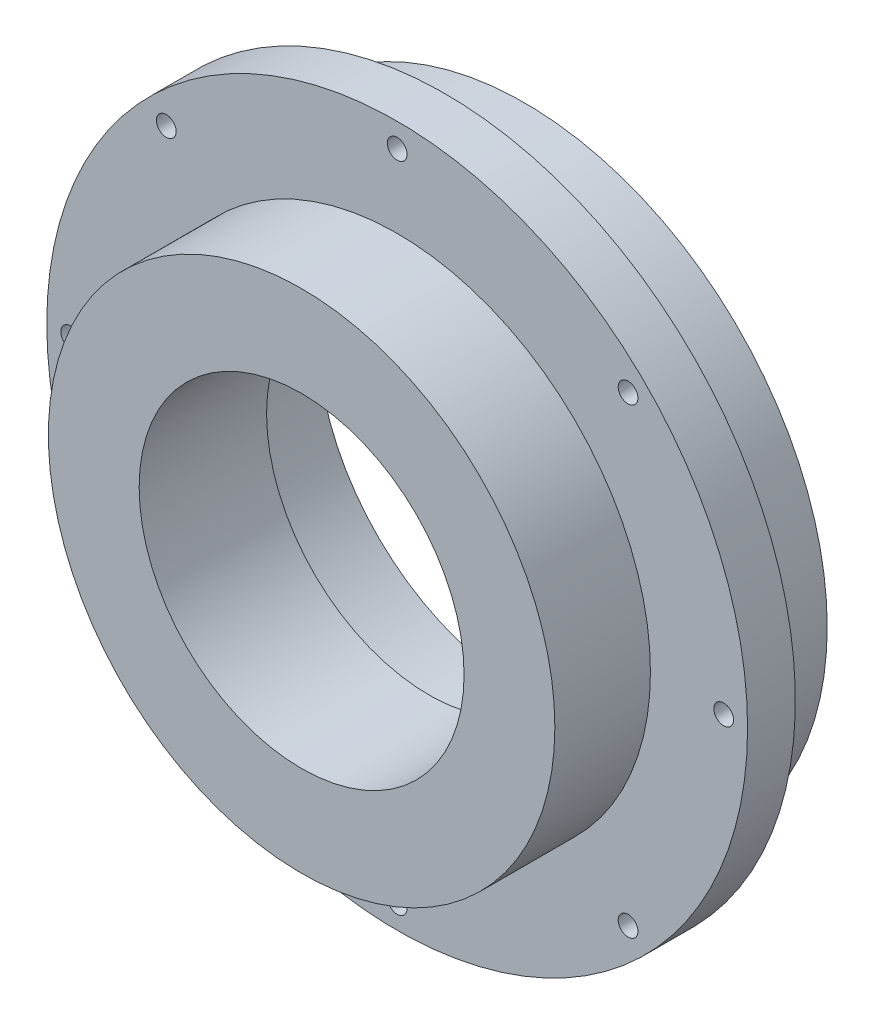
ISO-10303-21;
HEADER;
FILE_DESCRIPTION(('STEP AP214'),'2;1');
FILE_NAME('part.step','',(''),(''),'','','');
FILE_SCHEMA(('AUTOMOTIVE_DESIGN { 1 0 10303 214 1 1 1 1 }'));
ENDSEC;
DATA;
#1=APPLICATION_CONTEXT('core data for automotive mechanical design processes');
#2=APPLICATION_PROTOCOL_DEFINITION('international standard','automotive_design',2000,#1);
#3=PRODUCT_CONTEXT('',#1,'mechanical');
#4=PRODUCT('Part','Part','',(#3));
#5=PRODUCT_RELATED_PRODUCT_CATEGORY('part','',(#4));
#6=PRODUCT_DEFINITION_FORMATION('','',#4);
#7=PRODUCT_DEFINITION_CONTEXT('part definition',#1,'design');
#8=PRODUCT_DEFINITION('design','',#6,#7);
#9=PRODUCT_DEFINITION_SHAPE('','',#8);
#10=(LENGTH_UNIT() NAMED_UNIT(*) SI_UNIT(.MILLI.,.METRE.));
#11=(NAMED_UNIT(*) PLANE_ANGLE_UNIT() SI_UNIT($,.RADIAN.));
#12=(NAMED_UNIT(*) SI_UNIT($,.STERADIAN.) SOLID_ANGLE_UNIT());
#13=UNCERTAINTY_MEASURE_WITH_UNIT(LENGTH_MEASURE(1.E-05),#10,'distance_accuracy_value','');
#14=(GEOMETRIC_REPRESENTATION_CONTEXT(3) GLOBAL_UNCERTAINTY_ASSIGNED_CONTEXT((#13)) GLOBAL_UNIT_ASSIGNED_CONTEXT((#10,
#11,#12)) REPRESENTATION_CONTEXT('',''));
#15=CARTESIAN_POINT('',(0.,0.,0.));
#16=DIRECTION('',(0.,0.,1.));
#17=DIRECTION('',(1.,0.,0.));
#18=AXIS2_PLACEMENT_3D('',#15,#16,#17);
#19=CARTESIAN_POINT('',(0.,0.,10.));
#20=DIRECTION('',(0.,0.,-1.));
#21=DIRECTION('',(-1.,0.,0.));
#22=AXIS2_PLACEMENT_3D('',#19,#20,#21);
#23=CYLINDRICAL_SURFACE('',#22,55.);
#24=CARTESIAN_POINT('',(0.,0.,10.));
#25=DIRECTION('',(0.,0.,1.));
#26=DIRECTION('',(1.,0.,0.));
#27=AXIS2_PLACEMENT_3D('',#24,#25,#26);
#28=CIRCLE('',#27,55.);
#29=CARTESIAN_POINT('',(55.,0.,10.));
#30=VERTEX_POINT('',#29);
#31=EDGE_CURVE('E44',#30,#30,#28,.T.);
#32=ORIENTED_EDGE('',*,*,#31,.F.);
#33=EDGE_LOOP('',(#32));
#34=FACE_BOUND('',#33,.T.);
#35=CARTESIAN_POINT('',(0.,0.,2.5));
#36=DIRECTION('',(0.,0.,-1.));
#37=DIRECTION('',(-1.,0.,0.));
#38=AXIS2_PLACEMENT_3D('',#35,#36,#37);
#39=CIRCLE('',#38,55.);
#40=CARTESIAN_POINT('',(-55.,0.,2.5));
#41=VERTEX_POINT('',#40);
#42=EDGE_CURVE('E41',#41,#41,#39,.T.);
#43=ORIENTED_EDGE('',*,*,#42,.F.);
#44=EDGE_LOOP('',(#43));
#45=FACE_BOUND('',#44,.T.);
#46=ADVANCED_FACE('F36',(#34,#45),#23,.T.);
#47=CARTESIAN_POINT('',(0.,0.,10.));
#48=DIRECTION('',(0.,0.,1.));
#49=DIRECTION('',(1.,0.,0.));
#50=AXIS2_PLACEMENT_3D('',#47,#48,#49);
#51=PLANE('',#50);
#52=CARTESIAN_POINT('',(0.,0.,10.));
#53=DIRECTION('',(0.,0.,1.));
#54=DIRECTION('',(1.,0.,0.));
#55=AXIS2_PLACEMENT_3D('',#52,#53,#54);
#56=CIRCLE('',#55,39.75);
#57=CARTESIAN_POINT('',(39.75,0.,10.));
#58=VERTEX_POINT('',#57);
#59=EDGE_CURVE('E11',#58,#58,#56,.T.);
#60=ORIENTED_EDGE('',*,*,#59,.F.);
#61=EDGE_LOOP('',(#60));
#62=FACE_BOUND('',#61,.T.);
#63=CARTESIAN_POINT('',(51.25,-1.78938418615711E-13,10.));
#64=DIRECTION('',(0.,0.,-1.));
#65=DIRECTION('',(0.,1.,0.));
#66=AXIS2_PLACEMENT_3D('',#63,#64,#65);
#67=CIRCLE('',#66,1.55);
#68=CARTESIAN_POINT('',(51.25,1.54999999999982,10.));
#69=VERTEX_POINT('',#68);
#70=EDGE_CURVE('E77',#69,#69,#67,.T.);
#71=ORIENTED_EDGE('',*,*,#70,.T.);
#72=EDGE_LOOP('',(#71));
#73=FACE_BOUND('',#72,.T.);
#74=CARTESIAN_POINT('',(36.2392225358104,-36.2392225358108,10.));
#75=DIRECTION('',(0.,0.,-1.));
#76=DIRECTION('',(0.707106781186551,0.707106781186544,0.));
#77=AXIS2_PLACEMENT_3D('',#74,#75,#76);
#78=CIRCLE('',#77,1.55);
#79=CARTESIAN_POINT('',(37.3352380466495,-35.1432070249716,10.));
#80=VERTEX_POINT('',#79);
#81=EDGE_CURVE('E84',#80,#80,#78,.T.);
#82=ORIENTED_EDGE('',*,*,#81,.T.);
#83=EDGE_LOOP('',(#82));
#84=FACE_BOUND('',#83,.T.);
#85=CARTESIAN_POINT('',(0.,-51.25,10.));
#86=DIRECTION('',(0.,0.,-1.));
#87=DIRECTION('',(1.,0.,0.));
#88=AXIS2_PLACEMENT_3D('',#85,#86,#87);
#89=CIRCLE('',#88,1.55);
#90=CARTESIAN_POINT('',(1.55,-51.25,10.));
#91=VERTEX_POINT('',#90);
#92=EDGE_CURVE('E86',#91,#91,#89,.T.);
#93=ORIENTED_EDGE('',*,*,#92,.T.);
#94=EDGE_LOOP('',(#93));
#95=FACE_BOUND('',#94,.T.);
#96=CARTESIAN_POINT('',(-36.2392225358109,-36.2392225358102,10.));
#97=DIRECTION('',(0.,0.,-1.));
#98=DIRECTION('',(0.707106781186541,-0.707106781186554,0.));
#99=AXIS2_PLACEMENT_3D('',#96,#97,#98);
#100=CIRCLE('',#99,1.55);
#101=CARTESIAN_POINT('',(-35.1432070249717,-37.3352380466494,10.));
#102=VERTEX_POINT('',#101);
#103=EDGE_CURVE('E91',#102,#102,#100,.T.);
#104=ORIENTED_EDGE('',*,*,#103,.T.);
#105=EDGE_LOOP('',(#104));
#106=FACE_BOUND('',#105,.T.);
#107=CARTESIAN_POINT('',(-51.25,5.36815255847132E-13,10.));
#108=DIRECTION('',(0.,0.,-1.));
#109=DIRECTION('',(0.,-1.,0.));
#110=AXIS2_PLACEMENT_3D('',#107,#108,#109);
#111=CIRCLE('',#110,1.55);
#112=CARTESIAN_POINT('',(-51.25,-1.54999999999946,10.));
#113=VERTEX_POINT('',#112);
#114=EDGE_CURVE('E61',#113,#113,#111,.T.);
#115=ORIENTED_EDGE('',*,*,#114,.T.);
#116=EDGE_LOOP('',(#115));
#117=FACE_BOUND('',#116,.T.);
#118=CARTESIAN_POINT('',(-36.2392225358101,36.239222535811,10.));
#119=DIRECTION('',(0.,0.,-1.));
#120=DIRECTION('',(-0.707106781186556,-0.707106781186539,0.));
#121=AXIS2_PLACEMENT_3D('',#118,#119,#120);
#122=CIRCLE('',#121,1.55);
#123=CARTESIAN_POINT('',(-37.3352380466493,35.1432070249719,10.));
#124=VERTEX_POINT('',#123);
#125=EDGE_CURVE('E72',#124,#124,#122,.T.);
#126=ORIENTED_EDGE('',*,*,#125,.T.);
#127=EDGE_LOOP('',(#126));
#128=FACE_BOUND('',#127,.T.);
#129=CARTESIAN_POINT('',(36.2392225358106,36.2392225358105,10.));
#130=DIRECTION('',(0.,0.,-1.));
#131=DIRECTION('',(-0.707106781186546,0.707106781186549,0.));
#132=AXIS2_PLACEMENT_3D('',#129,#130,#131);
#133=CIRCLE('',#132,1.55);
#134=CARTESIAN_POINT('',(35.1432070249715,37.3352380466497,10.));
#135=VERTEX_POINT('',#134);
#136=EDGE_CURVE('E99',#135,#135,#133,.T.);
#137=ORIENTED_EDGE('',*,*,#136,.T.);
#138=EDGE_LOOP('',(#137));
#139=FACE_BOUND('',#138,.T.);
#140=CARTESIAN_POINT('',(0.,51.25,10.));
#141=DIRECTION('',(0.,0.,-1.));
#142=DIRECTION('',(-1.,0.,0.));
#143=AXIS2_PLACEMENT_3D('',#140,#141,#142);
#144=CIRCLE('',#143,1.55);
#145=CARTESIAN_POINT('',(-1.55,51.25,10.));
#146=VERTEX_POINT('',#145);
#147=EDGE_CURVE('E106',#146,#146,#144,.T.);
#148=ORIENTED_EDGE('',*,*,#147,.T.);
#149=EDGE_LOOP('',(#148));
#150=FACE_BOUND('',#149,.T.);
#151=ORIENTED_EDGE('',*,*,#31,.T.);
#152=EDGE_LOOP('',(#151));
#153=FACE_BOUND('',#152,.T.);
#154=ADVANCED_FACE('F134',(#62,#73,#84,#95,#106,#117,#128,#139,#150,#153),#51,.T.);
#155=CARTESIAN_POINT('',(0.,0.,2.5));
#156=DIRECTION('',(0.,0.,-1.));
#157=DIRECTION('',(-1.,0.,0.));
#158=AXIS2_PLACEMENT_3D('',#155,#156,#157);
#159=PLANE('',#158);
#160=CARTESIAN_POINT('',(51.25,-1.78938418615711E-13,2.5));
#161=DIRECTION('',(0.,0.,-1.));
#162=DIRECTION('',(0.,1.,0.));
#163=AXIS2_PLACEMENT_3D('',#160,#161,#162);
#164=CIRCLE('',#163,1.55);
#165=CARTESIAN_POINT('',(51.25,1.54999999999982,2.5));
#166=VERTEX_POINT('',#165);
#167=EDGE_CURVE('E78',#166,#166,#164,.T.);
#168=ORIENTED_EDGE('',*,*,#167,.F.);
#169=EDGE_LOOP('',(#168));
#170=FACE_BOUND('',#169,.T.);
#171=CARTESIAN_POINT('',(36.2392225358104,-36.2392225358108,2.5));
#172=DIRECTION('',(0.,0.,-1.));
#173=DIRECTION('',(0.707106781186551,0.707106781186544,0.));
#174=AXIS2_PLACEMENT_3D('',#171,#172,#173);
#175=CIRCLE('',#174,1.55);
#176=CARTESIAN_POINT('',(37.3352380466495,-35.1432070249716,2.5));
#177=VERTEX_POINT('',#176);
#178=EDGE_CURVE('E87',#177,#177,#175,.T.);
#179=ORIENTED_EDGE('',*,*,#178,.F.);
#180=EDGE_LOOP('',(#179));
#181=FACE_BOUND('',#180,.T.);
#182=CARTESIAN_POINT('',(0.,-51.25,2.5));
#183=DIRECTION('',(0.,0.,-1.));
#184=DIRECTION('',(1.,0.,0.));
#185=AXIS2_PLACEMENT_3D('',#182,#183,#184);
#186=CIRCLE('',#185,1.55);
#187=CARTESIAN_POINT('',(1.55,-51.25,2.5));
#188=VERTEX_POINT('',#187);
#189=EDGE_CURVE('E95',#188,#188,#186,.T.);
#190=ORIENTED_EDGE('',*,*,#189,.F.);
#191=EDGE_LOOP('',(#190));
#192=FACE_BOUND('',#191,.T.);
#193=CARTESIAN_POINT('',(-36.2392225358109,-36.2392225358102,2.5));
#194=DIRECTION('',(0.,0.,-1.));
#195=DIRECTION('',(0.707106781186541,-0.707106781186554,0.));
#196=AXIS2_PLACEMENT_3D('',#193,#194,#195);
#197=CIRCLE('',#196,1.55);
#198=CARTESIAN_POINT('',(-35.1432070249717,-37.3352380466494,2.5));
#199=VERTEX_POINT('',#198);
#200=EDGE_CURVE('E70',#199,#199,#197,.T.);
#201=ORIENTED_EDGE('',*,*,#200,.F.);
#202=EDGE_LOOP('',(#201));
#203=FACE_BOUND('',#202,.T.);
#204=CARTESIAN_POINT('',(-51.25,5.36815255847132E-13,2.5));
#205=DIRECTION('',(0.,0.,-1.));
#206=DIRECTION('',(0.,-1.,0.));
#207=AXIS2_PLACEMENT_3D('',#204,#205,#206);
#208=CIRCLE('',#207,1.55);
#209=CARTESIAN_POINT('',(-51.25,-1.54999999999946,2.5));
#210=VERTEX_POINT('',#209);
#211=EDGE_CURVE('E69',#210,#210,#208,.T.);
#212=ORIENTED_EDGE('',*,*,#211,.F.);
#213=EDGE_LOOP('',(#212));
#214=FACE_BOUND('',#213,.T.);
#215=CARTESIAN_POINT('',(-36.2392225358101,36.239222535811,2.5));
#216=DIRECTION('',(0.,0.,-1.));
#217=DIRECTION('',(-0.707106781186556,-0.707106781186539,0.));
#218=AXIS2_PLACEMENT_3D('',#215,#216,#217);
#219=CIRCLE('',#218,1.55);
#220=CARTESIAN_POINT('',(-37.3352380466493,35.1432070249719,2.5));
#221=VERTEX_POINT('',#220);
#222=EDGE_CURVE('E62',#221,#221,#219,.T.);
#223=ORIENTED_EDGE('',*,*,#222,.F.);
#224=EDGE_LOOP('',(#223));
#225=FACE_BOUND('',#224,.T.);
#226=CARTESIAN_POINT('',(36.2392225358106,36.2392225358105,2.5));
#227=DIRECTION('',(0.,0.,-1.));
#228=DIRECTION('',(-0.707106781186546,0.707106781186549,0.));
#229=AXIS2_PLACEMENT_3D('',#226,#227,#228);
#230=CIRCLE('',#229,1.55);
#231=CARTESIAN_POINT('',(35.1432070249715,37.3352380466497,2.5));
#232=VERTEX_POINT('',#231);
#233=EDGE_CURVE('E79',#232,#232,#230,.T.);
#234=ORIENTED_EDGE('',*,*,#233,.F.);
#235=EDGE_LOOP('',(#234));
#236=FACE_BOUND('',#235,.T.);
#237=CARTESIAN_POINT('',(0.,51.25,2.5));
#238=DIRECTION('',(0.,0.,-1.));
#239=DIRECTION('',(-1.,0.,0.));
#240=AXIS2_PLACEMENT_3D('',#237,#238,#239);
#241=CIRCLE('',#240,1.55);
#242=CARTESIAN_POINT('',(-1.55,51.25,2.5));
#243=VERTEX_POINT('',#242);
#244=EDGE_CURVE('E101',#243,#243,#241,.T.);
#245=ORIENTED_EDGE('',*,*,#244,.F.);
#246=EDGE_LOOP('',(#245));
#247=FACE_BOUND('',#246,.T.);
#248=CARTESIAN_POINT('',(0.,0.,2.5));
#249=DIRECTION('',(0.,0.,-1.));
#250=DIRECTION('',(-1.,0.,0.));
#251=AXIS2_PLACEMENT_3D('',#248,#249,#250);
#252=CIRCLE('',#251,47.5);
#253=CARTESIAN_POINT('',(-47.5,0.,2.5));
#254=VERTEX_POINT('',#253);
#255=EDGE_CURVE('E115',#254,#254,#252,.T.);
#256=ORIENTED_EDGE('',*,*,#255,.F.);
#257=EDGE_LOOP('',(#256));
#258=FACE_BOUND('',#257,.T.);
#259=ORIENTED_EDGE('',*,*,#42,.T.);
#260=EDGE_LOOP('',(#259));
#261=FACE_BOUND('',#260,.T.);
#262=ADVANCED_FACE('F125',(#170,#181,#192,#203,#214,#225,#236,#247,#258,#261),#159,.T.);
#263=CARTESIAN_POINT('',(0.,0.,2.5));
#264=DIRECTION('',(0.,0.,-1.));
#265=DIRECTION('',(-1.,0.,0.));
#266=AXIS2_PLACEMENT_3D('',#263,#264,#265);
#267=CYLINDRICAL_SURFACE('',#266,47.5);
#268=ORIENTED_EDGE('',*,*,#255,.T.);
#269=EDGE_LOOP('',(#268));
#270=FACE_BOUND('',#269,.T.);
#271=CARTESIAN_POINT('',(0.,0.,-10.));
#272=DIRECTION('',(0.,0.,-1.));
#273=DIRECTION('',(-1.,0.,0.));
#274=AXIS2_PLACEMENT_3D('',#271,#272,#273);
#275=CIRCLE('',#274,47.5);
#276=CARTESIAN_POINT('',(-47.5,0.,-10.));
#277=VERTEX_POINT('',#276);
#278=EDGE_CURVE('E107',#277,#277,#275,.T.);
#279=ORIENTED_EDGE('',*,*,#278,.F.);
#280=EDGE_LOOP('',(#279));
#281=FACE_BOUND('',#280,.T.);
#282=ADVANCED_FACE('F119',(#270,#281),#267,.T.);
#283=CARTESIAN_POINT('',(0.,0.,-10.));
#284=DIRECTION('',(0.,0.,1.));
#285=DIRECTION('',(1.,0.,0.));
#286=AXIS2_PLACEMENT_3D('',#283,#284,#285);
#287=PLANE('',#286);
#288=CARTESIAN_POINT('',(-39.2648801317297,16.2640458755162,-10.));
#289=DIRECTION('',(0.,0.,-1.));
#290=DIRECTION('',(-1.,0.,0.));
#291=AXIS2_PLACEMENT_3D('',#288,#289,#290);
#292=CIRCLE('',#291,1.5);
#293=CARTESIAN_POINT('',(-40.7648801317297,16.2640458755162,-10.));
#294=VERTEX_POINT('',#293);
#295=EDGE_CURVE('E297',#294,#294,#292,.T.);
#296=ORIENTED_EDGE('',*,*,#295,.F.);
#297=EDGE_LOOP('',(#296));
#298=FACE_BOUND('',#297,.T.);
#299=CARTESIAN_POINT('',(39.2648801317296,-16.2640458755165,-10.));
#300=DIRECTION('',(0.,0.,-1.));
#301=DIRECTION('',(-1.,0.,0.));
#302=AXIS2_PLACEMENT_3D('',#299,#300,#301);
#303=CIRCLE('',#302,1.5);
#304=CARTESIAN_POINT('',(37.7648801317296,-16.2640458755165,-10.));
#305=VERTEX_POINT('',#304);
#306=EDGE_CURVE('E317',#305,#305,#303,.T.);
#307=ORIENTED_EDGE('',*,*,#306,.F.);
#308=EDGE_LOOP('',(#307));
#309=FACE_BOUND('',#308,.T.);
#310=CARTESIAN_POINT('',(16.2640458755161,-39.2648801317298,-10.));
#311=DIRECTION('',(0.,0.,-1.));
#312=DIRECTION('',(-1.,0.,0.));
#313=AXIS2_PLACEMENT_3D('',#310,#311,#312);
#314=CIRCLE('',#313,1.46446648593793);
#315=CARTESIAN_POINT('',(14.7995793895782,-39.2648801317298,-10.));
#316=VERTEX_POINT('',#315);
#317=EDGE_CURVE('E335',#316,#316,#314,.T.);
#318=ORIENTED_EDGE('',*,*,#317,.F.);
#319=EDGE_LOOP('',(#318));
#320=FACE_BOUND('',#319,.T.);
#321=CARTESIAN_POINT('',(-39.2648801317296,-16.2640458755165,-10.));
#322=DIRECTION('',(0.,0.,-1.));
#323=DIRECTION('',(-1.,0.,0.));
#324=AXIS2_PLACEMENT_3D('',#321,#322,#323);
#325=CIRCLE('',#324,1.5);
#326=CARTESIAN_POINT('',(-40.7648801317296,-16.2640458755165,-10.));
#327=VERTEX_POINT('',#326);
#328=EDGE_CURVE('E323',#327,#327,#325,.T.);
#329=ORIENTED_EDGE('',*,*,#328,.F.);
#330=EDGE_LOOP('',(#329));
#331=FACE_BOUND('',#330,.T.);
#332=CARTESIAN_POINT('',(-16.2640458755163,39.2648801317297,-10.));
#333=DIRECTION('',(0.,0.,-1.));
#334=DIRECTION('',(-1.,0.,0.));
#335=AXIS2_PLACEMENT_3D('',#332,#333,#334);
#336=CIRCLE('',#335,1.5);
#337=CARTESIAN_POINT('',(-17.7640458755163,39.2648801317297,-10.));
#338=VERTEX_POINT('',#337);
#339=EDGE_CURVE('E294',#338,#338,#336,.T.);
#340=ORIENTED_EDGE('',*,*,#339,.F.);
#341=EDGE_LOOP('',(#340));
#342=FACE_BOUND('',#341,.T.);
#343=CARTESIAN_POINT('',(16.2640458755161,39.2648801317298,-10.));
#344=DIRECTION('',(0.,0.,-1.));
#345=DIRECTION('',(-1.,0.,0.));
#346=AXIS2_PLACEMENT_3D('',#343,#344,#345);
#347=CIRCLE('',#346,1.5);
#348=CARTESIAN_POINT('',(14.7640458755161,39.2648801317298,-10.));
#349=VERTEX_POINT('',#348);
#350=EDGE_CURVE('E305',#349,#349,#347,.T.);
#351=ORIENTED_EDGE('',*,*,#350,.F.);
#352=EDGE_LOOP('',(#351));
#353=FACE_BOUND('',#352,.T.);
#354=CARTESIAN_POINT('',(39.2648801317297,16.2640458755162,-10.));
#355=DIRECTION('',(0.,0.,-1.));
#356=DIRECTION('',(-1.,0.,0.));
#357=AXIS2_PLACEMENT_3D('',#354,#355,#356);
#358=CIRCLE('',#357,1.5);
#359=CARTESIAN_POINT('',(37.7648801317297,16.2640458755162,-10.));
#360=VERTEX_POINT('',#359);
#361=EDGE_CURVE('E309',#360,#360,#358,.T.);
#362=ORIENTED_EDGE('',*,*,#361,.F.);
#363=EDGE_LOOP('',(#362));
#364=FACE_BOUND('',#363,.T.);
#365=CARTESIAN_POINT('',(-16.2640458755161,-39.2648801317298,-10.));
#366=DIRECTION('',(0.,0.,-1.));
#367=DIRECTION('',(-1.,0.,0.));
#368=AXIS2_PLACEMENT_3D('',#365,#366,#367);
#369=CIRCLE('',#368,1.5);
#370=CARTESIAN_POINT('',(-17.7640458755161,-39.2648801317298,-10.));
#371=VERTEX_POINT('',#370);
#372=EDGE_CURVE('E329',#371,#371,#369,.T.);
#373=ORIENTED_EDGE('',*,*,#372,.F.);
#374=EDGE_LOOP('',(#373));
#375=FACE_BOUND('',#374,.T.);
#376=CARTESIAN_POINT('',(0.,0.,-10.));
#377=DIRECTION('',(0.,0.,-1.));
#378=DIRECTION('',(-1.,0.,0.));
#379=AXIS2_PLACEMENT_3D('',#376,#377,#378);
#380=CIRCLE('',#379,32.525);
#381=CARTESIAN_POINT('',(-32.525,0.,-10.));
#382=VERTEX_POINT('',#381);
#383=EDGE_CURVE('E60',#382,#382,#380,.T.);
#384=ORIENTED_EDGE('',*,*,#383,.F.);
#385=EDGE_LOOP('',(#384));
#386=FACE_BOUND('',#385,.T.);
#387=ORIENTED_EDGE('',*,*,#278,.T.);
#388=EDGE_LOOP('',(#387));
#389=FACE_BOUND('',#388,.T.);
#390=ADVANCED_FACE('F117',(#298,#309,#320,#331,#342,#353,#364,#375,#386,#389),#287,.F.);
#391=CARTESIAN_POINT('',(0.,51.25,10.));
#392=DIRECTION('',(0.,0.,-1.));
#393=DIRECTION('',(-1.,0.,0.));
#394=AXIS2_PLACEMENT_3D('',#391,#392,#393);
#395=CYLINDRICAL_SURFACE('',#394,1.55);
#396=ORIENTED_EDGE('',*,*,#147,.F.);
#397=EDGE_LOOP('',(#396));
#398=FACE_BOUND('',#397,.T.);
#399=ORIENTED_EDGE('',*,*,#244,.T.);
#400=EDGE_LOOP('',(#399));
#401=FACE_BOUND('',#400,.T.);
#402=ADVANCED_FACE('F128',(#398,#401),#395,.F.);
#403=CARTESIAN_POINT('',(36.2392225358106,36.2392225358105,10.));
#404=DIRECTION('',(0.,0.,-1.));
#405=DIRECTION('',(-1.,0.,0.));
#406=AXIS2_PLACEMENT_3D('',#403,#404,#405);
#407=CYLINDRICAL_SURFACE('',#406,1.55);
#408=ORIENTED_EDGE('',*,*,#136,.F.);
#409=EDGE_LOOP('',(#408));
#410=FACE_BOUND('',#409,.T.);
#411=ORIENTED_EDGE('',*,*,#233,.T.);
#412=EDGE_LOOP('',(#411));
#413=FACE_BOUND('',#412,.T.);
#414=ADVANCED_FACE('F171',(#410,#413),#407,.F.);
#415=CARTESIAN_POINT('',(-36.2392225358101,36.239222535811,10.));
#416=DIRECTION('',(0.,0.,-1.));
#417=DIRECTION('',(-1.,0.,0.));
#418=AXIS2_PLACEMENT_3D('',#415,#416,#417);
#419=CYLINDRICAL_SURFACE('',#418,1.55);
#420=ORIENTED_EDGE('',*,*,#125,.F.);
#421=EDGE_LOOP('',(#420));
#422=FACE_BOUND('',#421,.T.);
#423=ORIENTED_EDGE('',*,*,#222,.T.);
#424=EDGE_LOOP('',(#423));
#425=FACE_BOUND('',#424,.T.);
#426=ADVANCED_FACE('F177',(#422,#425),#419,.F.);
#427=CARTESIAN_POINT('',(-51.25,5.36815255847132E-13,10.));
#428=DIRECTION('',(0.,0.,-1.));
#429=DIRECTION('',(-1.,0.,0.));
#430=AXIS2_PLACEMENT_3D('',#427,#428,#429);
#431=CYLINDRICAL_SURFACE('',#430,1.55);
#432=ORIENTED_EDGE('',*,*,#114,.F.);
#433=EDGE_LOOP('',(#432));
#434=FACE_BOUND('',#433,.T.);
#435=ORIENTED_EDGE('',*,*,#211,.T.);
#436=EDGE_LOOP('',(#435));
#437=FACE_BOUND('',#436,.T.);
#438=ADVANCED_FACE('F190',(#434,#437),#431,.F.);
#439=CARTESIAN_POINT('',(-36.2392225358109,-36.2392225358102,10.));
#440=DIRECTION('',(0.,0.,-1.));
#441=DIRECTION('',(-1.,0.,0.));
#442=AXIS2_PLACEMENT_3D('',#439,#440,#441);
#443=CYLINDRICAL_SURFACE('',#442,1.55);
#444=ORIENTED_EDGE('',*,*,#103,.F.);
#445=EDGE_LOOP('',(#444));
#446=FACE_BOUND('',#445,.T.);
#447=ORIENTED_EDGE('',*,*,#200,.T.);
#448=EDGE_LOOP('',(#447));
#449=FACE_BOUND('',#448,.T.);
#450=ADVANCED_FACE('F182',(#446,#449),#443,.F.);
#451=CARTESIAN_POINT('',(0.,-51.25,10.));
#452=DIRECTION('',(0.,0.,-1.));
#453=DIRECTION('',(-1.,0.,0.));
#454=AXIS2_PLACEMENT_3D('',#451,#452,#453);
#455=CYLINDRICAL_SURFACE('',#454,1.55);
#456=ORIENTED_EDGE('',*,*,#92,.F.);
#457=EDGE_LOOP('',(#456));
#458=FACE_BOUND('',#457,.T.);
#459=ORIENTED_EDGE('',*,*,#189,.T.);
#460=EDGE_LOOP('',(#459));
#461=FACE_BOUND('',#460,.T.);
#462=ADVANCED_FACE('F187',(#458,#461),#455,.F.);
#463=CARTESIAN_POINT('',(36.2392225358104,-36.2392225358108,10.));
#464=DIRECTION('',(0.,0.,-1.));
#465=DIRECTION('',(-1.,0.,0.));
#466=AXIS2_PLACEMENT_3D('',#463,#464,#465);
#467=CYLINDRICAL_SURFACE('',#466,1.55);
#468=ORIENTED_EDGE('',*,*,#81,.F.);
#469=EDGE_LOOP('',(#468));
#470=FACE_BOUND('',#469,.T.);
#471=ORIENTED_EDGE('',*,*,#178,.T.);
#472=EDGE_LOOP('',(#471));
#473=FACE_BOUND('',#472,.T.);
#474=ADVANCED_FACE('F192',(#470,#473),#467,.F.);
#475=CARTESIAN_POINT('',(51.25,-1.78938418615711E-13,10.));
#476=DIRECTION('',(0.,0.,-1.));
#477=DIRECTION('',(-1.,0.,0.));
#478=AXIS2_PLACEMENT_3D('',#475,#476,#477);
#479=CYLINDRICAL_SURFACE('',#478,1.55);
#480=ORIENTED_EDGE('',*,*,#70,.F.);
#481=EDGE_LOOP('',(#480));
#482=FACE_BOUND('',#481,.T.);
#483=ORIENTED_EDGE('',*,*,#167,.T.);
#484=EDGE_LOOP('',(#483));
#485=FACE_BOUND('',#484,.T.);
#486=ADVANCED_FACE('F193',(#482,#485),#479,.F.);
#487=CARTESIAN_POINT('',(0.,0.,5.));
#488=DIRECTION('',(0.,0.,-1.));
#489=DIRECTION('',(-1.,0.,0.));
#490=AXIS2_PLACEMENT_3D('',#487,#488,#489);
#491=CYLINDRICAL_SURFACE('',#490,32.525);
#492=CARTESIAN_POINT('',(0.,0.,5.));
#493=DIRECTION('',(0.,0.,-1.));
#494=DIRECTION('',(-1.,0.,0.));
#495=AXIS2_PLACEMENT_3D('',#492,#493,#494);
#496=CIRCLE('',#495,32.525);
#497=CARTESIAN_POINT('',(-32.525,0.,5.));
#498=VERTEX_POINT('',#497);
#499=EDGE_CURVE('E59',#498,#498,#496,.T.);
#500=ORIENTED_EDGE('',*,*,#499,.F.);
#501=EDGE_LOOP('',(#500));
#502=FACE_BOUND('',#501,.T.);
#503=ORIENTED_EDGE('',*,*,#383,.T.);
#504=EDGE_LOOP('',(#503));
#505=FACE_BOUND('',#504,.T.);
#506=ADVANCED_FACE('F196',(#502,#505),#491,.F.);
#507=CARTESIAN_POINT('',(0.,0.,5.));
#508=DIRECTION('',(0.,0.,-1.));
#509=DIRECTION('',(-1.,0.,0.));
#510=AXIS2_PLACEMENT_3D('',#507,#508,#509);
#511=PLANE('',#510);
#512=CARTESIAN_POINT('',(0.,0.,5.));
#513=DIRECTION('',(0.,0.,-1.));
#514=DIRECTION('',(-1.,0.,0.));
#515=AXIS2_PLACEMENT_3D('',#512,#513,#514);
#516=CIRCLE('',#515,25.5);
#517=CARTESIAN_POINT('',(-25.5,0.,5.));
#518=VERTEX_POINT('',#517);
#519=EDGE_CURVE('E53',#518,#518,#516,.T.);
#520=ORIENTED_EDGE('',*,*,#519,.F.);
#521=EDGE_LOOP('',(#520));
#522=FACE_BOUND('',#521,.T.);
#523=ORIENTED_EDGE('',*,*,#499,.T.);
#524=EDGE_LOOP('',(#523));
#525=FACE_BOUND('',#524,.T.);
#526=ADVANCED_FACE('F209',(#522,#525),#511,.T.);
#527=CARTESIAN_POINT('',(0.,0.,10.));
#528=DIRECTION('',(0.,0.,-1.));
#529=DIRECTION('',(-1.,0.,0.));
#530=AXIS2_PLACEMENT_3D('',#527,#528,#529);
#531=CYLINDRICAL_SURFACE('',#530,25.5);
#532=ORIENTED_EDGE('',*,*,#519,.T.);
#533=EDGE_LOOP('',(#532));
#534=FACE_BOUND('',#533,.T.);
#535=CARTESIAN_POINT('',(0.,0.,25.));
#536=DIRECTION('',(0.,0.,1.));
#537=DIRECTION('',(1.,0.,0.));
#538=AXIS2_PLACEMENT_3D('',#535,#536,#537);
#539=CIRCLE('',#538,25.5);
#540=CARTESIAN_POINT('',(25.5,0.,25.));
#541=VERTEX_POINT('',#540);
#542=EDGE_CURVE('E338',#541,#541,#539,.T.);
#543=ORIENTED_EDGE('',*,*,#542,.T.);
#544=EDGE_LOOP('',(#543));
#545=FACE_BOUND('',#544,.T.);
#546=ADVANCED_FACE('F215',(#534,#545),#531,.F.);
#547=CARTESIAN_POINT('',(0.,0.,25.));
#548=DIRECTION('',(0.,0.,1.));
#549=DIRECTION('',(1.,0.,0.));
#550=AXIS2_PLACEMENT_3D('',#547,#548,#549);
#551=PLANE('',#550);
#552=CARTESIAN_POINT('',(0.,0.,25.));
#553=DIRECTION('',(0.,0.,1.));
#554=DIRECTION('',(1.,0.,0.));
#555=AXIS2_PLACEMENT_3D('',#552,#553,#554);
#556=CIRCLE('',#555,39.75);
#557=CARTESIAN_POINT('',(39.75,0.,25.));
#558=VERTEX_POINT('',#557);
#559=EDGE_CURVE('E55',#558,#558,#556,.T.);
#560=ORIENTED_EDGE('',*,*,#559,.T.);
#561=EDGE_LOOP('',(#560));
#562=FACE_BOUND('',#561,.T.);
#563=ORIENTED_EDGE('',*,*,#542,.F.);
#564=EDGE_LOOP('',(#563));
#565=FACE_BOUND('',#564,.T.);
#566=ADVANCED_FACE('F213',(#562,#565),#551,.T.);
#567=CARTESIAN_POINT('',(0.,0.,25.));
#568=DIRECTION('',(0.,0.,-1.));
#569=DIRECTION('',(-1.,0.,0.));
#570=AXIS2_PLACEMENT_3D('',#567,#568,#569);
#571=CYLINDRICAL_SURFACE('',#570,39.75);
#572=ORIENTED_EDGE('',*,*,#559,.F.);
#573=EDGE_LOOP('',(#572));
#574=FACE_BOUND('',#573,.T.);
#575=ORIENTED_EDGE('',*,*,#59,.T.);
#576=EDGE_LOOP('',(#575));
#577=FACE_BOUND('',#576,.T.);
#578=ADVANCED_FACE('F220',(#574,#577),#571,.T.);
#579=CARTESIAN_POINT('',(-16.2640458755161,-39.2648801317298,2.5));
#580=DIRECTION('',(0.,0.,-1.));
#581=DIRECTION('',(-1.,0.,0.));
#582=AXIS2_PLACEMENT_3D('',#579,#580,#581);
#583=CYLINDRICAL_SURFACE('',#582,1.5);
#584=CARTESIAN_POINT('',(-16.2640458755161,-39.2648801317298,2.5));
#585=DIRECTION('',(0.,0.,-1.));
#586=DIRECTION('',(-1.,0.,0.));
#587=AXIS2_PLACEMENT_3D('',#584,#585,#586);
#588=CIRCLE('',#587,1.5);
#589=CARTESIAN_POINT('',(-17.7640458755161,-39.2648801317298,2.5));
#590=VERTEX_POINT('',#589);
#591=EDGE_CURVE('E340',#590,#590,#588,.T.);
#592=ORIENTED_EDGE('',*,*,#591,.F.);
#593=EDGE_LOOP('',(#592));
#594=FACE_BOUND('',#593,.T.);
#595=ORIENTED_EDGE('',*,*,#372,.T.);
#596=EDGE_LOOP('',(#595));
#597=FACE_BOUND('',#596,.T.);
#598=ADVANCED_FACE('F218',(#594,#597),#583,.F.);
#599=CARTESIAN_POINT('',(-16.2640458755161,-39.2648801317298,2.5));
#600=DIRECTION('',(0.,0.,-1.));
#601=DIRECTION('',(-1.,0.,0.));
#602=AXIS2_PLACEMENT_3D('',#599,#600,#601);
#603=PLANE('',#602);
#604=ORIENTED_EDGE('',*,*,#591,.T.);
#605=EDGE_LOOP('',(#604));
#606=FACE_BOUND('',#605,.T.);
#607=ADVANCED_FACE('F227',(#606),#603,.T.);
#608=CARTESIAN_POINT('',(39.2648801317297,16.2640458755162,2.5));
#609=DIRECTION('',(0.,0.,-1.));
#610=DIRECTION('',(-1.,0.,0.));
#611=AXIS2_PLACEMENT_3D('',#608,#609,#610);
#612=CYLINDRICAL_SURFACE('',#611,1.5);
#613=CARTESIAN_POINT('',(39.2648801317297,16.2640458755162,2.5));
#614=DIRECTION('',(0.,0.,-1.));
#615=DIRECTION('',(-1.,0.,0.));
#616=AXIS2_PLACEMENT_3D('',#613,#614,#615);
#617=CIRCLE('',#616,1.5);
#618=CARTESIAN_POINT('',(37.7648801317297,16.2640458755162,2.5));
#619=VERTEX_POINT('',#618);
#620=EDGE_CURVE('E312',#619,#619,#617,.T.);
#621=ORIENTED_EDGE('',*,*,#620,.F.);
#622=EDGE_LOOP('',(#621));
#623=FACE_BOUND('',#622,.T.);
#624=ORIENTED_EDGE('',*,*,#361,.T.);
#625=EDGE_LOOP('',(#624));
#626=FACE_BOUND('',#625,.T.);
#627=ADVANCED_FACE('F233',(#623,#626),#612,.F.);
#628=CARTESIAN_POINT('',(39.2648801317297,16.2640458755162,2.5));
#629=DIRECTION('',(0.,0.,-1.));
#630=DIRECTION('',(-1.,0.,0.));
#631=AXIS2_PLACEMENT_3D('',#628,#629,#630);
#632=PLANE('',#631);
#633=ORIENTED_EDGE('',*,*,#620,.T.);
#634=EDGE_LOOP('',(#633));
#635=FACE_BOUND('',#634,.T.);
#636=ADVANCED_FACE('F267',(#635),#632,.T.);
#637=CARTESIAN_POINT('',(16.2640458755161,39.2648801317298,2.5));
#638=DIRECTION('',(0.,0.,-1.));
#639=DIRECTION('',(-1.,0.,0.));
#640=AXIS2_PLACEMENT_3D('',#637,#638,#639);
#641=CYLINDRICAL_SURFACE('',#640,1.5);
#642=CARTESIAN_POINT('',(16.2640458755161,39.2648801317298,2.5));
#643=DIRECTION('',(0.,0.,-1.));
#644=DIRECTION('',(-1.,0.,0.));
#645=AXIS2_PLACEMENT_3D('',#642,#643,#644);
#646=CIRCLE('',#645,1.5);
#647=CARTESIAN_POINT('',(14.7640458755161,39.2648801317298,2.5));
#648=VERTEX_POINT('',#647);
#649=EDGE_CURVE('E310',#648,#648,#646,.T.);
#650=ORIENTED_EDGE('',*,*,#649,.F.);
#651=EDGE_LOOP('',(#650));
#652=FACE_BOUND('',#651,.T.);
#653=ORIENTED_EDGE('',*,*,#350,.T.);
#654=EDGE_LOOP('',(#653));
#655=FACE_BOUND('',#654,.T.);
#656=ADVANCED_FACE('F269',(#652,#655),#641,.F.);
#657=CARTESIAN_POINT('',(16.2640458755161,39.2648801317298,2.5));
#658=DIRECTION('',(0.,0.,-1.));
#659=DIRECTION('',(-1.,0.,0.));
#660=AXIS2_PLACEMENT_3D('',#657,#658,#659);
#661=PLANE('',#660);
#662=ORIENTED_EDGE('',*,*,#649,.T.);
#663=EDGE_LOOP('',(#662));
#664=FACE_BOUND('',#663,.T.);
#665=ADVANCED_FACE('F274',(#664),#661,.T.);
#666=CARTESIAN_POINT('',(-16.2640458755163,39.2648801317297,2.5));
#667=DIRECTION('',(0.,0.,-1.));
#668=DIRECTION('',(-1.,0.,0.));
#669=AXIS2_PLACEMENT_3D('',#666,#667,#668);
#670=CYLINDRICAL_SURFACE('',#669,1.5);
#671=CARTESIAN_POINT('',(-16.2640458755163,39.2648801317297,2.5));
#672=DIRECTION('',(0.,0.,-1.));
#673=DIRECTION('',(-1.,0.,0.));
#674=AXIS2_PLACEMENT_3D('',#671,#672,#673);
#675=CIRCLE('',#674,1.5);
#676=CARTESIAN_POINT('',(-17.7640458755163,39.2648801317297,2.5));
#677=VERTEX_POINT('',#676);
#678=EDGE_CURVE('E292',#677,#677,#675,.T.);
#679=ORIENTED_EDGE('',*,*,#678,.F.);
#680=EDGE_LOOP('',(#679));
#681=FACE_BOUND('',#680,.T.);
#682=ORIENTED_EDGE('',*,*,#339,.T.);
#683=EDGE_LOOP('',(#682));
#684=FACE_BOUND('',#683,.T.);
#685=ADVANCED_FACE('F280',(#681,#684),#670,.F.);
#686=CARTESIAN_POINT('',(-16.2640458755163,39.2648801317297,2.5));
#687=DIRECTION('',(0.,0.,-1.));
#688=DIRECTION('',(-1.,0.,0.));
#689=AXIS2_PLACEMENT_3D('',#686,#687,#688);
#690=PLANE('',#689);
#691=ORIENTED_EDGE('',*,*,#678,.T.);
#692=EDGE_LOOP('',(#691));
#693=FACE_BOUND('',#692,.T.);
#694=ADVANCED_FACE('F248',(#693),#690,.T.);
#695=CARTESIAN_POINT('',(-39.2648801317296,-16.2640458755165,2.5));
#696=DIRECTION('',(0.,0.,-1.));
#697=DIRECTION('',(-1.,0.,0.));
#698=AXIS2_PLACEMENT_3D('',#695,#696,#697);
#699=CYLINDRICAL_SURFACE('',#698,1.5);
#700=CARTESIAN_POINT('',(-39.2648801317296,-16.2640458755165,2.5));
#701=DIRECTION('',(0.,0.,-1.));
#702=DIRECTION('',(-1.,0.,0.));
#703=AXIS2_PLACEMENT_3D('',#700,#701,#702);
#704=CIRCLE('',#703,1.5);
#705=CARTESIAN_POINT('',(-40.7648801317296,-16.2640458755165,2.5));
#706=VERTEX_POINT('',#705);
#707=EDGE_CURVE('E326',#706,#706,#704,.T.);
#708=ORIENTED_EDGE('',*,*,#707,.F.);
#709=EDGE_LOOP('',(#708));
#710=FACE_BOUND('',#709,.T.);
#711=ORIENTED_EDGE('',*,*,#328,.T.);
#712=EDGE_LOOP('',(#711));
#713=FACE_BOUND('',#712,.T.);
#714=ADVANCED_FACE('F244',(#710,#713),#699,.F.);
#715=CARTESIAN_POINT('',(-39.2648801317296,-16.2640458755165,2.5));
#716=DIRECTION('',(0.,0.,-1.));
#717=DIRECTION('',(-1.,0.,0.));
#718=AXIS2_PLACEMENT_3D('',#715,#716,#717);
#719=PLANE('',#718);
#720=ORIENTED_EDGE('',*,*,#707,.T.);
#721=EDGE_LOOP('',(#720));
#722=FACE_BOUND('',#721,.T.);
#723=ADVANCED_FACE('F241',(#722),#719,.T.);
#724=CARTESIAN_POINT('',(16.2640458755161,-39.2648801317298,2.5));
#725=DIRECTION('',(0.,0.,-1.));
#726=DIRECTION('',(-1.,0.,0.));
#727=AXIS2_PLACEMENT_3D('',#724,#725,#726);
#728=CYLINDRICAL_SURFACE('',#727,1.46446648593793);
#729=CARTESIAN_POINT('',(16.2640458755161,-39.2648801317298,2.5));
#730=DIRECTION('',(0.,0.,-1.));
#731=DIRECTION('',(-1.,0.,0.));
#732=AXIS2_PLACEMENT_3D('',#729,#730,#731);
#733=CIRCLE('',#732,1.46446648593793);
#734=CARTESIAN_POINT('',(14.7995793895782,-39.2648801317298,2.5));
#735=VERTEX_POINT('',#734);
#736=EDGE_CURVE('E316',#735,#735,#733,.T.);
#737=ORIENTED_EDGE('',*,*,#736,.F.);
#738=EDGE_LOOP('',(#737));
#739=FACE_BOUND('',#738,.T.);
#740=ORIENTED_EDGE('',*,*,#317,.T.);
#741=EDGE_LOOP('',(#740));
#742=FACE_BOUND('',#741,.T.);
#743=ADVANCED_FACE('F240',(#739,#742),#728,.F.);
#744=CARTESIAN_POINT('',(16.2640458755161,-39.2648801317298,2.5));
#745=DIRECTION('',(0.,0.,-1.));
#746=DIRECTION('',(-1.,0.,0.));
#747=AXIS2_PLACEMENT_3D('',#744,#745,#746);
#748=PLANE('',#747);
#749=ORIENTED_EDGE('',*,*,#736,.T.);
#750=EDGE_LOOP('',(#749));
#751=FACE_BOUND('',#750,.T.);
#752=ADVANCED_FACE('F231',(#751),#748,.T.);
#753=CARTESIAN_POINT('',(39.2648801317296,-16.2640458755165,2.5));
#754=DIRECTION('',(0.,0.,-1.));
#755=DIRECTION('',(-1.,0.,0.));
#756=AXIS2_PLACEMENT_3D('',#753,#754,#755);
#757=CYLINDRICAL_SURFACE('',#756,1.5);
#758=CARTESIAN_POINT('',(39.2648801317296,-16.2640458755165,2.5));
#759=DIRECTION('',(0.,0.,-1.));
#760=DIRECTION('',(-1.,0.,0.));
#761=AXIS2_PLACEMENT_3D('',#758,#759,#760);
#762=CIRCLE('',#761,1.5);
#763=CARTESIAN_POINT('',(37.7648801317296,-16.2640458755165,2.5));
#764=VERTEX_POINT('',#763);
#765=EDGE_CURVE('E318',#764,#764,#762,.T.);
#766=ORIENTED_EDGE('',*,*,#765,.F.);
#767=EDGE_LOOP('',(#766));
#768=FACE_BOUND('',#767,.T.);
#769=ORIENTED_EDGE('',*,*,#306,.T.);
#770=EDGE_LOOP('',(#769));
#771=FACE_BOUND('',#770,.T.);
#772=ADVANCED_FACE('F236',(#768,#771),#757,.F.);
#773=CARTESIAN_POINT('',(39.2648801317296,-16.2640458755165,2.5));
#774=DIRECTION('',(0.,0.,-1.));
#775=DIRECTION('',(-1.,0.,0.));
#776=AXIS2_PLACEMENT_3D('',#773,#774,#775);
#777=PLANE('',#776);
#778=ORIENTED_EDGE('',*,*,#765,.T.);
#779=EDGE_LOOP('',(#778));
#780=FACE_BOUND('',#779,.T.);
#781=ADVANCED_FACE('F259',(#780),#777,.T.);
#782=CARTESIAN_POINT('',(-39.2648801317297,16.2640458755162,2.5));
#783=DIRECTION('',(0.,0.,-1.));
#784=DIRECTION('',(-1.,0.,0.));
#785=AXIS2_PLACEMENT_3D('',#782,#783,#784);
#786=CYLINDRICAL_SURFACE('',#785,1.5);
#787=CARTESIAN_POINT('',(-39.2648801317297,16.2640458755162,2.5));
#788=DIRECTION('',(0.,0.,-1.));
#789=DIRECTION('',(-1.,0.,0.));
#790=AXIS2_PLACEMENT_3D('',#787,#788,#789);
#791=CIRCLE('',#790,1.5);
#792=CARTESIAN_POINT('',(-40.7648801317297,16.2640458755162,2.5));
#793=VERTEX_POINT('',#792);
#794=EDGE_CURVE('E300',#793,#793,#791,.T.);
#795=ORIENTED_EDGE('',*,*,#794,.F.);
#796=EDGE_LOOP('',(#795));
#797=FACE_BOUND('',#796,.T.);
#798=ORIENTED_EDGE('',*,*,#295,.T.);
#799=EDGE_LOOP('',(#798));
#800=FACE_BOUND('',#799,.T.);
#801=ADVANCED_FACE('F251',(#797,#800),#786,.F.);
#802=CARTESIAN_POINT('',(-39.2648801317297,16.2640458755162,2.5));
#803=DIRECTION('',(0.,0.,-1.));
#804=DIRECTION('',(-1.,0.,0.));
#805=AXIS2_PLACEMENT_3D('',#802,#803,#804);
#806=PLANE('',#805);
#807=ORIENTED_EDGE('',*,*,#794,.T.);
#808=EDGE_LOOP('',(#807));
#809=FACE_BOUND('',#808,.T.);
#810=ADVANCED_FACE('F252',(#809),#806,.T.);
#811=CLOSED_SHELL('',(#46,#154,#262,#282,#390,#402,#414,#426,#438,#450,#462,#474,#486,#506,#526,
#546,#566,#578,#598,#607,#627,#636,#656,#665,#685,#694,#714,#723,#743,#752,#772,#781,#801,#810));
#812=MANIFOLD_SOLID_BREP('B2',#811);
#813=ADVANCED_BREP_SHAPE_REPRESENTATION('',(#18,#812),#14);
#814=SHAPE_DEFINITION_REPRESENTATION(#9,#813);
ENDSEC;
END-ISO-10303-21;
